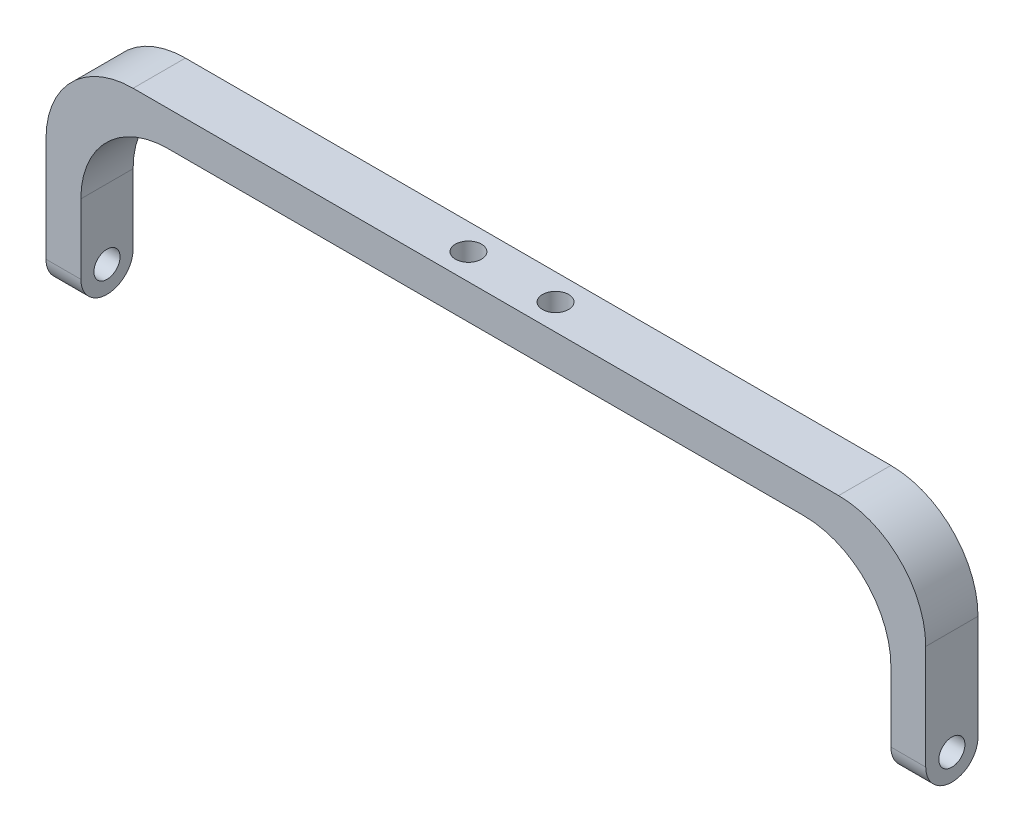
ISO-10303-21;
HEADER;
FILE_DESCRIPTION(('STEP AP214'),'2;1');
FILE_NAME('part.step','',(''),(''),'','','');
FILE_SCHEMA(('AUTOMOTIVE_DESIGN { 1 0 10303 214 1 1 1 1 }'));
ENDSEC;
DATA;
#1=APPLICATION_CONTEXT('core data for automotive mechanical design processes');
#2=APPLICATION_PROTOCOL_DEFINITION('international standard','automotive_design',2000,#1);
#3=PRODUCT_CONTEXT('',#1,'mechanical');
#4=PRODUCT('Part','Part','',(#3));
#5=PRODUCT_RELATED_PRODUCT_CATEGORY('part','',(#4));
#6=PRODUCT_DEFINITION_FORMATION('','',#4);
#7=PRODUCT_DEFINITION_CONTEXT('part definition',#1,'design');
#8=PRODUCT_DEFINITION('design','',#6,#7);
#9=PRODUCT_DEFINITION_SHAPE('','',#8);
#10=(LENGTH_UNIT() NAMED_UNIT(*) SI_UNIT(.MILLI.,.METRE.));
#11=(NAMED_UNIT(*) PLANE_ANGLE_UNIT() SI_UNIT($,.RADIAN.));
#12=(NAMED_UNIT(*) SI_UNIT($,.STERADIAN.) SOLID_ANGLE_UNIT());
#13=UNCERTAINTY_MEASURE_WITH_UNIT(LENGTH_MEASURE(1.E-05),#10,'distance_accuracy_value','');
#14=(GEOMETRIC_REPRESENTATION_CONTEXT(3) GLOBAL_UNCERTAINTY_ASSIGNED_CONTEXT((#13)) GLOBAL_UNIT_ASSIGNED_CONTEXT((#10,
#11,#12)) REPRESENTATION_CONTEXT('',''));
#15=CARTESIAN_POINT('',(0.,0.,0.));
#16=DIRECTION('',(0.,0.,1.));
#17=DIRECTION('',(1.,0.,0.));
#18=AXIS2_PLACEMENT_3D('',#15,#16,#17);
#19=CARTESIAN_POINT('',(-153.044043164262,112.385212048333,6.));
#20=DIRECTION('',(-1.,0.,0.));
#21=DIRECTION('',(0.,0.,1.));
#22=AXIS2_PLACEMENT_3D('',#19,#20,#21);
#23=PLANE('',#22);
#24=CARTESIAN_POINT('',(-153.044043164262,94.3816338343274,3.));
#25=DIRECTION('',(-1.,0.,0.));
#26=DIRECTION('',(0.,0.,1.));
#27=AXIS2_PLACEMENT_3D('',#24,#25,#26);
#28=CIRCLE('',#27,1.5);
#29=CARTESIAN_POINT('',(-153.044043164262,94.3816338343274,4.5));
#30=VERTEX_POINT('',#29);
#31=EDGE_CURVE('E251',#30,#30,#28,.T.);
#32=ORIENTED_EDGE('',*,*,#31,.T.);
#33=EDGE_LOOP('',(#32));
#34=FACE_BOUND('',#33,.T.);
#35=CARTESIAN_POINT('',(-153.044043164262,94.3852120483329,3.));
#36=DIRECTION('',(-1.,0.,0.));
#37=DIRECTION('',(0.,0.,1.));
#38=AXIS2_PLACEMENT_3D('',#35,#36,#37);
#39=CIRCLE('',#38,3.);
#40=CARTESIAN_POINT('',(-153.044043164262,94.3852120483329,6.));
#41=VERTEX_POINT('',#40);
#42=CARTESIAN_POINT('',(-153.044043164262,91.3852120483329,3.));
#43=VERTEX_POINT('',#42);
#44=EDGE_CURVE('E56',#41,#43,#39,.F.);
#45=ORIENTED_EDGE('',*,*,#44,.T.);
#46=CARTESIAN_POINT('',(-153.044043164262,94.3852120483329,3.));
#47=DIRECTION('',(-1.,0.,0.));
#48=DIRECTION('',(0.,0.,1.));
#49=AXIS2_PLACEMENT_3D('',#46,#47,#48);
#50=CIRCLE('',#49,3.);
#51=CARTESIAN_POINT('',(-153.044043164262,94.3852120483329,0.));
#52=VERTEX_POINT('',#51);
#53=EDGE_CURVE('E224',#43,#52,#50,.F.);
#54=ORIENTED_EDGE('',*,*,#53,.T.);
#55=DIRECTION('',(0.,1.,0.));
#56=VECTOR('',#55,1.);
#57=CARTESIAN_POINT('',(-153.044043164262,112.385212048333,0.));
#58=LINE('',#57,#56);
#59=CARTESIAN_POINT('',(-153.044043164262,102.385212048333,0.));
#60=VERTEX_POINT('',#59);
#61=EDGE_CURVE('E254',#52,#60,#58,.T.);
#62=ORIENTED_EDGE('',*,*,#61,.T.);
#63=DIRECTION('',(0.,0.,-1.));
#64=VECTOR('',#63,1.);
#65=CARTESIAN_POINT('',(-153.044043164262,102.385212048333,6.));
#66=LINE('',#65,#64);
#67=CARTESIAN_POINT('',(-153.044043164262,102.385212048333,6.));
#68=VERTEX_POINT('',#67);
#69=EDGE_CURVE('E193',#60,#68,#66,.F.);
#70=ORIENTED_EDGE('',*,*,#69,.T.);
#71=DIRECTION('',(0.,1.,0.));
#72=VECTOR('',#71,1.);
#73=CARTESIAN_POINT('',(-153.044043164262,112.385212048333,6.));
#74=LINE('',#73,#72);
#75=EDGE_CURVE('E163',#41,#68,#74,.T.);
#76=ORIENTED_EDGE('',*,*,#75,.F.);
#77=EDGE_LOOP('',(#45,#54,#62,#70,#76));
#78=FACE_BOUND('',#77,.T.);
#79=ADVANCED_FACE('F33',(#34,#78),#23,.F.);
#80=CARTESIAN_POINT('',(-60.0440431642623,112.385212048333,6.));
#81=DIRECTION('',(0.,1.,0.));
#82=DIRECTION('',(0.,0.,1.));
#83=AXIS2_PLACEMENT_3D('',#80,#81,#82);
#84=PLANE('',#83);
#85=CARTESIAN_POINT('',(-101.544043164262,112.385212048333,3.));
#86=DIRECTION('',(0.,1.,0.));
#87=DIRECTION('',(0.,0.,1.));
#88=AXIS2_PLACEMENT_3D('',#85,#86,#87);
#89=CIRCLE('',#88,1.5);
#90=CARTESIAN_POINT('',(-101.544043164262,112.385212048333,4.5));
#91=VERTEX_POINT('',#90);
#92=EDGE_CURVE('E243',#91,#91,#89,.T.);
#93=ORIENTED_EDGE('',*,*,#92,.T.);
#94=EDGE_LOOP('',(#93));
#95=FACE_BOUND('',#94,.T.);
#96=CARTESIAN_POINT('',(-111.544043164262,112.385212048333,3.));
#97=DIRECTION('',(0.,1.,0.));
#98=DIRECTION('',(0.,0.,-1.));
#99=AXIS2_PLACEMENT_3D('',#96,#97,#98);
#100=CIRCLE('',#99,1.5);
#101=CARTESIAN_POINT('',(-111.544043164262,112.385212048333,1.5));
#102=VERTEX_POINT('',#101);
#103=EDGE_CURVE('E234',#102,#102,#100,.T.);
#104=ORIENTED_EDGE('',*,*,#103,.T.);
#105=EDGE_LOOP('',(#104));
#106=FACE_BOUND('',#105,.T.);
#107=DIRECTION('',(1.,0.,0.));
#108=VECTOR('',#107,1.);
#109=CARTESIAN_POINT('',(-60.0440431642623,112.385212048333,0.));
#110=LINE('',#109,#108);
#111=CARTESIAN_POINT('',(-143.044043164262,112.385212048333,0.));
#112=VERTEX_POINT('',#111);
#113=CARTESIAN_POINT('',(-70.0440431642623,112.385212048333,0.));
#114=VERTEX_POINT('',#113);
#115=EDGE_CURVE('E268',#112,#114,#110,.T.);
#116=ORIENTED_EDGE('',*,*,#115,.T.);
#117=DIRECTION('',(0.,0.,-1.));
#118=VECTOR('',#117,1.);
#119=CARTESIAN_POINT('',(-70.0440431642623,112.385212048333,6.));
#120=LINE('',#119,#118);
#121=CARTESIAN_POINT('',(-70.0440431642623,112.385212048333,6.));
#122=VERTEX_POINT('',#121);
#123=EDGE_CURVE('E191',#114,#122,#120,.F.);
#124=ORIENTED_EDGE('',*,*,#123,.T.);
#125=DIRECTION('',(1.,0.,0.));
#126=VECTOR('',#125,1.);
#127=CARTESIAN_POINT('',(-60.0440431642623,112.385212048333,6.));
#128=LINE('',#127,#126);
#129=CARTESIAN_POINT('',(-143.044043164262,112.385212048333,6.));
#130=VERTEX_POINT('',#129);
#131=EDGE_CURVE('E256',#130,#122,#128,.T.);
#132=ORIENTED_EDGE('',*,*,#131,.F.);
#133=DIRECTION('',(0.,0.,-1.));
#134=VECTOR('',#133,1.);
#135=CARTESIAN_POINT('',(-143.044043164262,112.385212048333,0.));
#136=LINE('',#135,#134);
#137=EDGE_CURVE('E188',#130,#112,#136,.T.);
#138=ORIENTED_EDGE('',*,*,#137,.T.);
#139=EDGE_LOOP('',(#116,#124,#132,#138));
#140=FACE_BOUND('',#139,.T.);
#141=ADVANCED_FACE('F293',(#95,#106,#140),#84,.F.);
#142=CARTESIAN_POINT('',(-60.0440431642623,91.3852120483329,6.));
#143=DIRECTION('',(1.,0.,0.));
#144=DIRECTION('',(0.,0.,-1.));
#145=AXIS2_PLACEMENT_3D('',#142,#143,#144);
#146=PLANE('',#145);
#147=CARTESIAN_POINT('',(-60.0440431642623,94.3816338343274,3.));
#148=DIRECTION('',(1.,0.,0.));
#149=DIRECTION('',(0.,0.,-1.));
#150=AXIS2_PLACEMENT_3D('',#147,#148,#149);
#151=CIRCLE('',#150,1.5);
#152=CARTESIAN_POINT('',(-60.0440431642623,94.3816338343274,1.5));
#153=VERTEX_POINT('',#152);
#154=EDGE_CURVE('E172',#153,#153,#151,.T.);
#155=ORIENTED_EDGE('',*,*,#154,.T.);
#156=EDGE_LOOP('',(#155));
#157=FACE_BOUND('',#156,.T.);
#158=CARTESIAN_POINT('',(-60.0440431642623,94.3852120483329,3.));
#159=DIRECTION('',(1.,0.,0.));
#160=DIRECTION('',(0.,0.,-1.));
#161=AXIS2_PLACEMENT_3D('',#158,#159,#160);
#162=CIRCLE('',#161,3.);
#163=CARTESIAN_POINT('',(-60.0440431642623,94.3852120483329,0.));
#164=VERTEX_POINT('',#163);
#165=CARTESIAN_POINT('',(-60.0440431642623,91.3852120483329,3.));
#166=VERTEX_POINT('',#165);
#167=EDGE_CURVE('E214',#164,#166,#162,.F.);
#168=ORIENTED_EDGE('',*,*,#167,.T.);
#169=CARTESIAN_POINT('',(-60.0440431642623,94.3852120483329,3.));
#170=DIRECTION('',(1.,0.,0.));
#171=DIRECTION('',(0.,0.,-1.));
#172=AXIS2_PLACEMENT_3D('',#169,#170,#171);
#173=CIRCLE('',#172,3.);
#174=CARTESIAN_POINT('',(-60.0440431642623,94.3852120483329,6.));
#175=VERTEX_POINT('',#174);
#176=EDGE_CURVE('E216',#166,#175,#173,.F.);
#177=ORIENTED_EDGE('',*,*,#176,.T.);
#178=DIRECTION('',(0.,-1.,0.));
#179=VECTOR('',#178,1.);
#180=CARTESIAN_POINT('',(-60.0440431642623,91.3852120483329,6.));
#181=LINE('',#180,#179);
#182=CARTESIAN_POINT('',(-60.0440431642623,102.385212048333,6.));
#183=VERTEX_POINT('',#182);
#184=EDGE_CURVE('E259',#183,#175,#181,.T.);
#185=ORIENTED_EDGE('',*,*,#184,.F.);
#186=DIRECTION('',(0.,0.,-1.));
#187=VECTOR('',#186,1.);
#188=CARTESIAN_POINT('',(-60.0440431642623,102.385212048333,0.));
#189=LINE('',#188,#187);
#190=CARTESIAN_POINT('',(-60.0440431642623,102.385212048333,0.));
#191=VERTEX_POINT('',#190);
#192=EDGE_CURVE('E185',#183,#191,#189,.T.);
#193=ORIENTED_EDGE('',*,*,#192,.T.);
#194=DIRECTION('',(0.,-1.,0.));
#195=VECTOR('',#194,1.);
#196=CARTESIAN_POINT('',(-60.0440431642623,91.3852120483329,0.));
#197=LINE('',#196,#195);
#198=EDGE_CURVE('E165',#191,#164,#197,.T.);
#199=ORIENTED_EDGE('',*,*,#198,.T.);
#200=EDGE_LOOP('',(#168,#177,#185,#193,#199));
#201=FACE_BOUND('',#200,.T.);
#202=ADVANCED_FACE('F274',(#157,#201),#146,.F.);
#203=CARTESIAN_POINT('',(-56.0440431642623,116.385212048333,6.));
#204=DIRECTION('',(-1.,0.,0.));
#205=DIRECTION('',(0.,0.,1.));
#206=AXIS2_PLACEMENT_3D('',#203,#204,#205);
#207=PLANE('',#206);
#208=CARTESIAN_POINT('',(-56.0440431642623,94.3816338343274,3.));
#209=DIRECTION('',(1.,0.,0.));
#210=DIRECTION('',(0.,0.,-1.));
#211=AXIS2_PLACEMENT_3D('',#208,#209,#210);
#212=CIRCLE('',#211,1.5);
#213=CARTESIAN_POINT('',(-56.0440431642623,94.3816338343274,1.5));
#214=VERTEX_POINT('',#213);
#215=EDGE_CURVE('E173',#214,#214,#212,.T.);
#216=ORIENTED_EDGE('',*,*,#215,.F.);
#217=EDGE_LOOP('',(#216));
#218=FACE_BOUND('',#217,.T.);
#219=DIRECTION('',(0.,1.,0.));
#220=VECTOR('',#219,1.);
#221=CARTESIAN_POINT('',(-56.0440431642623,116.385212048333,6.));
#222=LINE('',#221,#220);
#223=CARTESIAN_POINT('',(-56.0440431642623,94.3852120483329,6.));
#224=VERTEX_POINT('',#223);
#225=CARTESIAN_POINT('',(-56.0440431642623,106.385212048333,6.));
#226=VERTEX_POINT('',#225);
#227=EDGE_CURVE('E262',#224,#226,#222,.T.);
#228=ORIENTED_EDGE('',*,*,#227,.F.);
#229=CARTESIAN_POINT('',(-56.0440431642623,94.3852120483329,3.));
#230=DIRECTION('',(-1.,0.,0.));
#231=DIRECTION('',(0.,0.,1.));
#232=AXIS2_PLACEMENT_3D('',#229,#230,#231);
#233=CIRCLE('',#232,3.);
#234=CARTESIAN_POINT('',(-56.0440431642623,91.3852120483329,3.));
#235=VERTEX_POINT('',#234);
#236=EDGE_CURVE('E212',#224,#235,#233,.F.);
#237=ORIENTED_EDGE('',*,*,#236,.T.);
#238=CARTESIAN_POINT('',(-56.0440431642623,94.3852120483329,3.));
#239=DIRECTION('',(-1.,0.,0.));
#240=DIRECTION('',(0.,0.,1.));
#241=AXIS2_PLACEMENT_3D('',#238,#239,#240);
#242=CIRCLE('',#241,3.);
#243=CARTESIAN_POINT('',(-56.0440431642623,94.3852120483329,0.));
#244=VERTEX_POINT('',#243);
#245=EDGE_CURVE('E210',#235,#244,#242,.F.);
#246=ORIENTED_EDGE('',*,*,#245,.T.);
#247=DIRECTION('',(0.,1.,0.));
#248=VECTOR('',#247,1.);
#249=CARTESIAN_POINT('',(-56.0440431642623,116.385212048333,0.));
#250=LINE('',#249,#248);
#251=CARTESIAN_POINT('',(-56.0440431642623,106.385212048333,0.));
#252=VERTEX_POINT('',#251);
#253=EDGE_CURVE('E161',#244,#252,#250,.T.);
#254=ORIENTED_EDGE('',*,*,#253,.T.);
#255=DIRECTION('',(0.,0.,-1.));
#256=VECTOR('',#255,1.);
#257=CARTESIAN_POINT('',(-56.0440431642623,106.385212048333,6.));
#258=LINE('',#257,#256);
#259=EDGE_CURVE('E142',#252,#226,#258,.F.);
#260=ORIENTED_EDGE('',*,*,#259,.T.);
#261=EDGE_LOOP('',(#228,#237,#246,#254,#260));
#262=FACE_BOUND('',#261,.T.);
#263=ADVANCED_FACE('F344',(#218,#262),#207,.F.);
#264=CARTESIAN_POINT('',(-157.044043164262,116.385212048333,6.));
#265=DIRECTION('',(0.,-1.,0.));
#266=DIRECTION('',(0.,0.,-1.));
#267=AXIS2_PLACEMENT_3D('',#264,#265,#266);
#268=PLANE('',#267);
#269=CARTESIAN_POINT('',(-101.544043164262,116.385212048333,3.));
#270=DIRECTION('',(0.,1.,0.));
#271=DIRECTION('',(0.,0.,1.));
#272=AXIS2_PLACEMENT_3D('',#269,#270,#271);
#273=CIRCLE('',#272,1.5);
#274=CARTESIAN_POINT('',(-101.544043164262,116.385212048333,4.5));
#275=VERTEX_POINT('',#274);
#276=EDGE_CURVE('E246',#275,#275,#273,.T.);
#277=ORIENTED_EDGE('',*,*,#276,.F.);
#278=EDGE_LOOP('',(#277));
#279=FACE_BOUND('',#278,.T.);
#280=CARTESIAN_POINT('',(-111.544043164262,116.385212048333,3.));
#281=DIRECTION('',(0.,1.,0.));
#282=DIRECTION('',(0.,0.,-1.));
#283=AXIS2_PLACEMENT_3D('',#280,#281,#282);
#284=CIRCLE('',#283,1.5);
#285=CARTESIAN_POINT('',(-111.544043164262,116.385212048333,1.5));
#286=VERTEX_POINT('',#285);
#287=EDGE_CURVE('E238',#286,#286,#284,.T.);
#288=ORIENTED_EDGE('',*,*,#287,.F.);
#289=EDGE_LOOP('',(#288));
#290=FACE_BOUND('',#289,.T.);
#291=DIRECTION('',(-1.,0.,0.));
#292=VECTOR('',#291,1.);
#293=CARTESIAN_POINT('',(-157.044043164262,116.385212048333,6.));
#294=LINE('',#293,#292);
#295=CARTESIAN_POINT('',(-66.0440431642623,116.385212048333,6.));
#296=VERTEX_POINT('',#295);
#297=CARTESIAN_POINT('',(-147.044043164262,116.385212048333,6.));
#298=VERTEX_POINT('',#297);
#299=EDGE_CURVE('E155',#296,#298,#294,.T.);
#300=ORIENTED_EDGE('',*,*,#299,.F.);
#301=DIRECTION('',(0.,0.,-1.));
#302=VECTOR('',#301,1.);
#303=CARTESIAN_POINT('',(-66.0440431642623,116.385212048333,6.));
#304=LINE('',#303,#302);
#305=CARTESIAN_POINT('',(-66.0440431642623,116.385212048333,0.));
#306=VERTEX_POINT('',#305);
#307=EDGE_CURVE('E140',#296,#306,#304,.T.);
#308=ORIENTED_EDGE('',*,*,#307,.T.);
#309=DIRECTION('',(-1.,0.,0.));
#310=VECTOR('',#309,1.);
#311=CARTESIAN_POINT('',(-157.044043164262,116.385212048333,0.));
#312=LINE('',#311,#310);
#313=CARTESIAN_POINT('',(-147.044043164262,116.385212048333,0.));
#314=VERTEX_POINT('',#313);
#315=EDGE_CURVE('E152',#306,#314,#312,.T.);
#316=ORIENTED_EDGE('',*,*,#315,.T.);
#317=DIRECTION('',(0.,0.,-1.));
#318=VECTOR('',#317,1.);
#319=CARTESIAN_POINT('',(-147.044043164262,116.385212048333,6.));
#320=LINE('',#319,#318);
#321=EDGE_CURVE('E156',#314,#298,#320,.F.);
#322=ORIENTED_EDGE('',*,*,#321,.T.);
#323=EDGE_LOOP('',(#300,#308,#316,#322));
#324=FACE_BOUND('',#323,.T.);
#325=ADVANCED_FACE('F151',(#279,#290,#324),#268,.F.);
#326=CARTESIAN_POINT('',(-157.044043164262,91.3852120483329,6.));
#327=DIRECTION('',(1.,0.,0.));
#328=DIRECTION('',(0.,0.,-1.));
#329=AXIS2_PLACEMENT_3D('',#326,#327,#328);
#330=PLANE('',#329);
#331=CARTESIAN_POINT('',(-157.044043164262,94.3816338343274,3.));
#332=DIRECTION('',(1.,0.,0.));
#333=DIRECTION('',(0.,0.,-1.));
#334=AXIS2_PLACEMENT_3D('',#331,#332,#333);
#335=CIRCLE('',#334,1.5);
#336=CARTESIAN_POINT('',(-157.044043164262,94.3816338343274,1.5));
#337=VERTEX_POINT('',#336);
#338=EDGE_CURVE('E169',#337,#337,#335,.T.);
#339=ORIENTED_EDGE('',*,*,#338,.T.);
#340=EDGE_LOOP('',(#339));
#341=FACE_BOUND('',#340,.T.);
#342=DIRECTION('',(0.,-1.,0.));
#343=VECTOR('',#342,1.);
#344=CARTESIAN_POINT('',(-157.044043164262,91.3852120483329,0.));
#345=LINE('',#344,#343);
#346=CARTESIAN_POINT('',(-157.044043164262,106.385212048333,0.));
#347=VERTEX_POINT('',#346);
#348=CARTESIAN_POINT('',(-157.044043164262,94.3852120483329,0.));
#349=VERTEX_POINT('',#348);
#350=EDGE_CURVE('E160',#347,#349,#345,.T.);
#351=ORIENTED_EDGE('',*,*,#350,.T.);
#352=CARTESIAN_POINT('',(-157.044043164262,94.3852120483329,3.));
#353=DIRECTION('',(1.,0.,0.));
#354=DIRECTION('',(0.,0.,-1.));
#355=AXIS2_PLACEMENT_3D('',#352,#353,#354);
#356=CIRCLE('',#355,3.);
#357=CARTESIAN_POINT('',(-157.044043164262,91.3852120483329,3.));
#358=VERTEX_POINT('',#357);
#359=EDGE_CURVE('E11',#349,#358,#356,.F.);
#360=ORIENTED_EDGE('',*,*,#359,.T.);
#361=CARTESIAN_POINT('',(-157.044043164262,94.3852120483329,3.));
#362=DIRECTION('',(1.,0.,0.));
#363=DIRECTION('',(0.,0.,-1.));
#364=AXIS2_PLACEMENT_3D('',#361,#362,#363);
#365=CIRCLE('',#364,3.);
#366=CARTESIAN_POINT('',(-157.044043164262,94.3852120483329,6.));
#367=VERTEX_POINT('',#366);
#368=EDGE_CURVE('E42',#358,#367,#365,.F.);
#369=ORIENTED_EDGE('',*,*,#368,.T.);
#370=DIRECTION('',(0.,-1.,0.));
#371=VECTOR('',#370,1.);
#372=CARTESIAN_POINT('',(-157.044043164262,91.3852120483329,6.));
#373=LINE('',#372,#371);
#374=CARTESIAN_POINT('',(-157.044043164262,106.385212048333,6.));
#375=VERTEX_POINT('',#374);
#376=EDGE_CURVE('E174',#375,#367,#373,.T.);
#377=ORIENTED_EDGE('',*,*,#376,.F.);
#378=DIRECTION('',(0.,0.,-1.));
#379=VECTOR('',#378,1.);
#380=CARTESIAN_POINT('',(-157.044043164262,106.385212048333,6.));
#381=LINE('',#380,#379);
#382=EDGE_CURVE('E182',#375,#347,#381,.T.);
#383=ORIENTED_EDGE('',*,*,#382,.T.);
#384=EDGE_LOOP('',(#351,#360,#369,#377,#383));
#385=FACE_BOUND('',#384,.T.);
#386=ADVANCED_FACE('F342',(#341,#385),#330,.F.);
#387=CARTESIAN_POINT('',(0.,0.,6.));
#388=DIRECTION('',(0.,0.,-1.));
#389=DIRECTION('',(-1.,0.,0.));
#390=AXIS2_PLACEMENT_3D('',#387,#388,#389);
#391=PLANE('',#390);
#392=ORIENTED_EDGE('',*,*,#184,.T.);
#393=DIRECTION('',(1.,0.,0.));
#394=VECTOR('',#393,1.);
#395=CARTESIAN_POINT('',(0.,94.3852120483329,6.));
#396=LINE('',#395,#394);
#397=EDGE_CURVE('E207',#175,#224,#396,.T.);
#398=ORIENTED_EDGE('',*,*,#397,.T.);
#399=ORIENTED_EDGE('',*,*,#227,.T.);
#400=CARTESIAN_POINT('',(-66.0440431642623,106.385212048333,6.));
#401=DIRECTION('',(0.,0.,-1.));
#402=DIRECTION('',(-1.,0.,0.));
#403=AXIS2_PLACEMENT_3D('',#400,#401,#402);
#404=CIRCLE('',#403,10.);
#405=EDGE_CURVE('E180',#226,#296,#404,.F.);
#406=ORIENTED_EDGE('',*,*,#405,.T.);
#407=ORIENTED_EDGE('',*,*,#299,.T.);
#408=CARTESIAN_POINT('',(-147.044043164262,106.385212048333,6.));
#409=DIRECTION('',(0.,0.,-1.));
#410=DIRECTION('',(-1.,0.,0.));
#411=AXIS2_PLACEMENT_3D('',#408,#409,#410);
#412=CIRCLE('',#411,10.);
#413=EDGE_CURVE('E178',#298,#375,#412,.F.);
#414=ORIENTED_EDGE('',*,*,#413,.T.);
#415=ORIENTED_EDGE('',*,*,#376,.T.);
#416=DIRECTION('',(1.,0.,0.));
#417=VECTOR('',#416,1.);
#418=CARTESIAN_POINT('',(0.,94.3852120483329,6.));
#419=LINE('',#418,#417);
#420=EDGE_CURVE('E205',#367,#41,#419,.T.);
#421=ORIENTED_EDGE('',*,*,#420,.T.);
#422=ORIENTED_EDGE('',*,*,#75,.T.);
#423=CARTESIAN_POINT('',(-143.044043164262,102.385212048333,6.));
#424=DIRECTION('',(0.,0.,-1.));
#425=DIRECTION('',(-1.,0.,0.));
#426=AXIS2_PLACEMENT_3D('',#423,#424,#425);
#427=CIRCLE('',#426,10.);
#428=EDGE_CURVE('E203',#68,#130,#427,.T.);
#429=ORIENTED_EDGE('',*,*,#428,.T.);
#430=ORIENTED_EDGE('',*,*,#131,.T.);
#431=CARTESIAN_POINT('',(-70.0440431642623,102.385212048333,6.));
#432=DIRECTION('',(0.,0.,-1.));
#433=DIRECTION('',(-1.,0.,0.));
#434=AXIS2_PLACEMENT_3D('',#431,#432,#433);
#435=CIRCLE('',#434,10.);
#436=EDGE_CURVE('E198',#122,#183,#435,.T.);
#437=ORIENTED_EDGE('',*,*,#436,.T.);
#438=EDGE_LOOP('',(#392,#398,#399,#406,#407,#414,#415,#421,#422,#429,#430,#437));
#439=FACE_BOUND('',#438,.T.);
#440=ADVANCED_FACE('F284',(#439),#391,.F.);
#441=CARTESIAN_POINT('',(0.,0.,0.));
#442=DIRECTION('',(0.,0.,-1.));
#443=DIRECTION('',(-1.,0.,0.));
#444=AXIS2_PLACEMENT_3D('',#441,#442,#443);
#445=PLANE('',#444);
#446=ORIENTED_EDGE('',*,*,#253,.F.);
#447=DIRECTION('',(1.,0.,0.));
#448=VECTOR('',#447,1.);
#449=CARTESIAN_POINT('',(-60.0440431642623,94.3852120483329,0.));
#450=LINE('',#449,#448);
#451=EDGE_CURVE('E221',#244,#164,#450,.F.);
#452=ORIENTED_EDGE('',*,*,#451,.T.);
#453=ORIENTED_EDGE('',*,*,#198,.F.);
#454=CARTESIAN_POINT('',(-70.0440431642623,102.385212048333,0.));
#455=DIRECTION('',(0.,0.,-1.));
#456=DIRECTION('',(-1.,0.,0.));
#457=AXIS2_PLACEMENT_3D('',#454,#455,#456);
#458=CIRCLE('',#457,10.);
#459=EDGE_CURVE('E196',#191,#114,#458,.F.);
#460=ORIENTED_EDGE('',*,*,#459,.T.);
#461=ORIENTED_EDGE('',*,*,#115,.F.);
#462=CARTESIAN_POINT('',(-143.044043164262,102.385212048333,0.));
#463=DIRECTION('',(0.,0.,-1.));
#464=DIRECTION('',(-1.,0.,0.));
#465=AXIS2_PLACEMENT_3D('',#462,#463,#464);
#466=CIRCLE('',#465,10.);
#467=EDGE_CURVE('E200',#112,#60,#466,.F.);
#468=ORIENTED_EDGE('',*,*,#467,.T.);
#469=ORIENTED_EDGE('',*,*,#61,.F.);
#470=DIRECTION('',(1.,0.,0.));
#471=VECTOR('',#470,1.);
#472=CARTESIAN_POINT('',(-157.044043164262,94.3852120483329,0.));
#473=LINE('',#472,#471);
#474=EDGE_CURVE('E218',#52,#349,#473,.F.);
#475=ORIENTED_EDGE('',*,*,#474,.T.);
#476=ORIENTED_EDGE('',*,*,#350,.F.);
#477=CARTESIAN_POINT('',(-147.044043164262,106.385212048333,0.));
#478=DIRECTION('',(0.,0.,-1.));
#479=DIRECTION('',(-1.,0.,0.));
#480=AXIS2_PLACEMENT_3D('',#477,#478,#479);
#481=CIRCLE('',#480,10.);
#482=EDGE_CURVE('E146',#347,#314,#481,.T.);
#483=ORIENTED_EDGE('',*,*,#482,.T.);
#484=ORIENTED_EDGE('',*,*,#315,.F.);
#485=CARTESIAN_POINT('',(-66.0440431642623,106.385212048333,0.));
#486=DIRECTION('',(0.,0.,-1.));
#487=DIRECTION('',(-1.,0.,0.));
#488=AXIS2_PLACEMENT_3D('',#485,#486,#487);
#489=CIRCLE('',#488,10.);
#490=EDGE_CURVE('E136',#306,#252,#489,.T.);
#491=ORIENTED_EDGE('',*,*,#490,.T.);
#492=EDGE_LOOP('',(#446,#452,#453,#460,#461,#468,#469,#475,#476,#483,#484,#491));
#493=FACE_BOUND('',#492,.T.);
#494=ADVANCED_FACE('F158',(#493),#445,.T.);
#495=CARTESIAN_POINT('',(-160.044043164262,94.3816338343274,3.));
#496=DIRECTION('',(1.,0.,0.));
#497=DIRECTION('',(0.,0.,-1.));
#498=AXIS2_PLACEMENT_3D('',#495,#496,#497);
#499=CYLINDRICAL_SURFACE('',#498,1.5);
#500=ORIENTED_EDGE('',*,*,#338,.F.);
#501=EDGE_LOOP('',(#500));
#502=FACE_BOUND('',#501,.T.);
#503=ORIENTED_EDGE('',*,*,#31,.F.);
#504=EDGE_LOOP('',(#503));
#505=FACE_BOUND('',#504,.T.);
#506=ADVANCED_FACE('F362',(#502,#505),#499,.F.);
#507=ORIENTED_EDGE('',*,*,#215,.T.);
#508=EDGE_LOOP('',(#507));
#509=FACE_BOUND('',#508,.T.);
#510=ORIENTED_EDGE('',*,*,#154,.F.);
#511=EDGE_LOOP('',(#510));
#512=FACE_BOUND('',#511,.T.);
#513=ADVANCED_FACE('F315',(#509,#512),#499,.F.);
#514=CARTESIAN_POINT('',(-66.0440431642623,106.385212048333,6.));
#515=DIRECTION('',(0.,0.,-1.));
#516=DIRECTION('',(-1.,0.,0.));
#517=AXIS2_PLACEMENT_3D('',#514,#515,#516);
#518=CYLINDRICAL_SURFACE('',#517,10.);
#519=ORIENTED_EDGE('',*,*,#405,.F.);
#520=ORIENTED_EDGE('',*,*,#259,.F.);
#521=ORIENTED_EDGE('',*,*,#490,.F.);
#522=ORIENTED_EDGE('',*,*,#307,.F.);
#523=EDGE_LOOP('',(#519,#520,#521,#522));
#524=FACE_BOUND('',#523,.T.);
#525=ADVANCED_FACE('F139',(#524),#518,.T.);
#526=CARTESIAN_POINT('',(-147.044043164262,106.385212048333,6.));
#527=DIRECTION('',(0.,0.,-1.));
#528=DIRECTION('',(-1.,0.,0.));
#529=AXIS2_PLACEMENT_3D('',#526,#527,#528);
#530=CYLINDRICAL_SURFACE('',#529,10.);
#531=ORIENTED_EDGE('',*,*,#413,.F.);
#532=ORIENTED_EDGE('',*,*,#321,.F.);
#533=ORIENTED_EDGE('',*,*,#482,.F.);
#534=ORIENTED_EDGE('',*,*,#382,.F.);
#535=EDGE_LOOP('',(#531,#532,#533,#534));
#536=FACE_BOUND('',#535,.T.);
#537=ADVANCED_FACE('F314',(#536),#530,.T.);
#538=CARTESIAN_POINT('',(-70.0440431642623,102.385212048333,6.));
#539=DIRECTION('',(0.,0.,1.));
#540=DIRECTION('',(1.,0.,0.));
#541=AXIS2_PLACEMENT_3D('',#538,#539,#540);
#542=CYLINDRICAL_SURFACE('',#541,10.);
#543=ORIENTED_EDGE('',*,*,#436,.F.);
#544=ORIENTED_EDGE('',*,*,#123,.F.);
#545=ORIENTED_EDGE('',*,*,#459,.F.);
#546=ORIENTED_EDGE('',*,*,#192,.F.);
#547=EDGE_LOOP('',(#543,#544,#545,#546));
#548=FACE_BOUND('',#547,.T.);
#549=ADVANCED_FACE('F290',(#548),#542,.F.);
#550=CARTESIAN_POINT('',(-143.044043164262,102.385212048333,6.));
#551=DIRECTION('',(0.,0.,1.));
#552=DIRECTION('',(1.,0.,0.));
#553=AXIS2_PLACEMENT_3D('',#550,#551,#552);
#554=CYLINDRICAL_SURFACE('',#553,10.);
#555=ORIENTED_EDGE('',*,*,#428,.F.);
#556=ORIENTED_EDGE('',*,*,#69,.F.);
#557=ORIENTED_EDGE('',*,*,#467,.F.);
#558=ORIENTED_EDGE('',*,*,#137,.F.);
#559=EDGE_LOOP('',(#555,#556,#557,#558));
#560=FACE_BOUND('',#559,.T.);
#561=ADVANCED_FACE('F297',(#560),#554,.F.);
#562=CARTESIAN_POINT('',(-56.0440431642623,94.3852120483329,3.));
#563=DIRECTION('',(-1.,0.,0.));
#564=DIRECTION('',(0.,0.,1.));
#565=AXIS2_PLACEMENT_3D('',#562,#563,#564);
#566=CYLINDRICAL_SURFACE('',#565,3.);
#567=DIRECTION('',(1.,0.,0.));
#568=VECTOR('',#567,1.);
#569=CARTESIAN_POINT('',(-56.0440431642623,91.3852120483329,3.));
#570=LINE('',#569,#568);
#571=EDGE_CURVE('E226',#166,#235,#570,.T.);
#572=ORIENTED_EDGE('',*,*,#571,.F.);
#573=ORIENTED_EDGE('',*,*,#167,.F.);
#574=ORIENTED_EDGE('',*,*,#451,.F.);
#575=ORIENTED_EDGE('',*,*,#245,.F.);
#576=EDGE_LOOP('',(#572,#573,#574,#575));
#577=FACE_BOUND('',#576,.T.);
#578=ADVANCED_FACE('F279',(#577),#566,.T.);
#579=CARTESIAN_POINT('',(0.,94.3852120483329,3.));
#580=DIRECTION('',(1.,0.,0.));
#581=DIRECTION('',(0.,0.,-1.));
#582=AXIS2_PLACEMENT_3D('',#579,#580,#581);
#583=CYLINDRICAL_SURFACE('',#582,3.);
#584=ORIENTED_EDGE('',*,*,#176,.F.);
#585=ORIENTED_EDGE('',*,*,#571,.T.);
#586=ORIENTED_EDGE('',*,*,#236,.F.);
#587=ORIENTED_EDGE('',*,*,#397,.F.);
#588=EDGE_LOOP('',(#584,#585,#586,#587));
#589=FACE_BOUND('',#588,.T.);
#590=ADVANCED_FACE('F282',(#589),#583,.T.);
#591=CARTESIAN_POINT('',(0.,94.3852120483329,3.));
#592=DIRECTION('',(1.,0.,0.));
#593=DIRECTION('',(0.,0.,-1.));
#594=AXIS2_PLACEMENT_3D('',#591,#592,#593);
#595=CYLINDRICAL_SURFACE('',#594,3.);
#596=ORIENTED_EDGE('',*,*,#420,.F.);
#597=ORIENTED_EDGE('',*,*,#368,.F.);
#598=DIRECTION('',(1.,0.,0.));
#599=VECTOR('',#598,1.);
#600=CARTESIAN_POINT('',(-153.044043164262,91.3852120483329,3.));
#601=LINE('',#600,#599);
#602=EDGE_CURVE('E37',#43,#358,#601,.F.);
#603=ORIENTED_EDGE('',*,*,#602,.F.);
#604=ORIENTED_EDGE('',*,*,#44,.F.);
#605=EDGE_LOOP('',(#596,#597,#603,#604));
#606=FACE_BOUND('',#605,.T.);
#607=ADVANCED_FACE('F35',(#606),#595,.T.);
#608=CARTESIAN_POINT('',(-153.044043164262,94.3852120483329,3.));
#609=DIRECTION('',(-1.,0.,0.));
#610=DIRECTION('',(0.,0.,1.));
#611=AXIS2_PLACEMENT_3D('',#608,#609,#610);
#612=CYLINDRICAL_SURFACE('',#611,3.);
#613=ORIENTED_EDGE('',*,*,#359,.F.);
#614=ORIENTED_EDGE('',*,*,#474,.F.);
#615=ORIENTED_EDGE('',*,*,#53,.F.);
#616=ORIENTED_EDGE('',*,*,#602,.T.);
#617=EDGE_LOOP('',(#613,#614,#615,#616));
#618=FACE_BOUND('',#617,.T.);
#619=ADVANCED_FACE('F301',(#618),#612,.T.);
#620=CARTESIAN_POINT('',(-111.544043164262,112.385212048333,3.));
#621=DIRECTION('',(0.,1.,0.));
#622=DIRECTION('',(0.,0.,1.));
#623=AXIS2_PLACEMENT_3D('',#620,#621,#622);
#624=CYLINDRICAL_SURFACE('',#623,1.5);
#625=ORIENTED_EDGE('',*,*,#103,.F.);
#626=EDGE_LOOP('',(#625));
#627=FACE_BOUND('',#626,.T.);
#628=ORIENTED_EDGE('',*,*,#287,.T.);
#629=EDGE_LOOP('',(#628));
#630=FACE_BOUND('',#629,.T.);
#631=ADVANCED_FACE('F327',(#627,#630),#624,.F.);
#632=CARTESIAN_POINT('',(-101.544043164262,112.385212048333,3.));
#633=DIRECTION('',(0.,1.,0.));
#634=DIRECTION('',(0.,0.,1.));
#635=AXIS2_PLACEMENT_3D('',#632,#633,#634);
#636=CYLINDRICAL_SURFACE('',#635,1.5);
#637=ORIENTED_EDGE('',*,*,#92,.F.);
#638=EDGE_LOOP('',(#637));
#639=FACE_BOUND('',#638,.T.);
#640=ORIENTED_EDGE('',*,*,#276,.T.);
#641=EDGE_LOOP('',(#640));
#642=FACE_BOUND('',#641,.T.);
#643=ADVANCED_FACE('F332',(#639,#642),#636,.F.);
#644=CLOSED_SHELL('',(#79,#141,#202,#263,#325,#386,#440,#494,#506,#513,#525,#537,#549,#561,#578,
#590,#607,#619,#631,#643));
#645=MANIFOLD_SOLID_BREP('B2',#644);
#646=ADVANCED_BREP_SHAPE_REPRESENTATION('',(#18,#645),#14);
#647=SHAPE_DEFINITION_REPRESENTATION(#9,#646);
ENDSEC;
END-ISO-10303-21;
